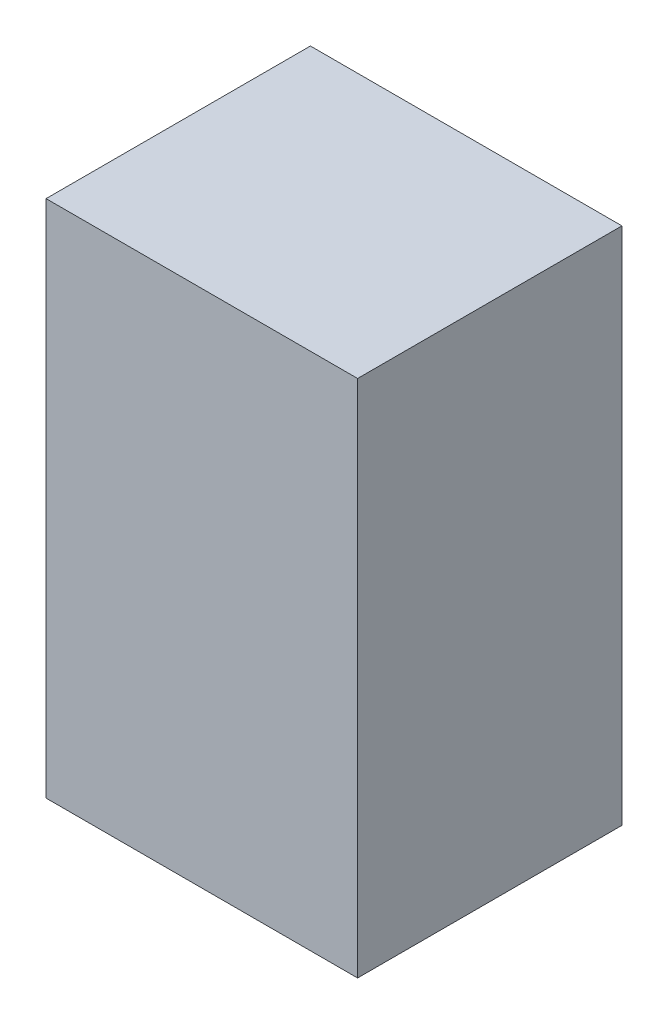
ISO-10303-21;
HEADER;
FILE_DESCRIPTION(('STEP AP214'),'2;1');
FILE_NAME('part.step','',(''),(''),'','','');
FILE_SCHEMA(('AUTOMOTIVE_DESIGN { 1 0 10303 214 1 1 1 1 }'));
ENDSEC;
DATA;
#1=APPLICATION_CONTEXT('core data for automotive mechanical design processes');
#2=APPLICATION_PROTOCOL_DEFINITION('international standard','automotive_design',2000,#1);
#3=PRODUCT_CONTEXT('',#1,'mechanical');
#4=PRODUCT('Part','Part','',(#3));
#5=PRODUCT_RELATED_PRODUCT_CATEGORY('part','',(#4));
#6=PRODUCT_DEFINITION_FORMATION('','',#4);
#7=PRODUCT_DEFINITION_CONTEXT('part definition',#1,'design');
#8=PRODUCT_DEFINITION('design','',#6,#7);
#9=PRODUCT_DEFINITION_SHAPE('','',#8);
#10=(LENGTH_UNIT() NAMED_UNIT(*) SI_UNIT(.MILLI.,.METRE.));
#11=(NAMED_UNIT(*) PLANE_ANGLE_UNIT() SI_UNIT($,.RADIAN.));
#12=(NAMED_UNIT(*) SI_UNIT($,.STERADIAN.) SOLID_ANGLE_UNIT());
#13=UNCERTAINTY_MEASURE_WITH_UNIT(LENGTH_MEASURE(1.E-05),#10,'distance_accuracy_value','');
#14=(GEOMETRIC_REPRESENTATION_CONTEXT(3) GLOBAL_UNCERTAINTY_ASSIGNED_CONTEXT((#13)) GLOBAL_UNIT_ASSIGNED_CONTEXT((#10,
#11,#12)) REPRESENTATION_CONTEXT('',''));
#15=CARTESIAN_POINT('',(0.,0.,0.));
#16=DIRECTION('',(0.,0.,1.));
#17=DIRECTION('',(1.,0.,0.));
#18=AXIS2_PLACEMENT_3D('',#15,#16,#17);
#19=CARTESIAN_POINT('',(419.1,1397.,355.6));
#20=DIRECTION('',(-1.,0.,0.));
#21=DIRECTION('',(0.,0.,1.));
#22=AXIS2_PLACEMENT_3D('',#19,#20,#21);
#23=PLANE('',#22);
#24=DIRECTION('',(0.,0.,-1.));
#25=VECTOR('',#24,1.);
#26=CARTESIAN_POINT('',(419.1,0.,355.6));
#27=LINE('',#26,#25);
#28=CARTESIAN_POINT('',(419.1,0.,355.6));
#29=VERTEX_POINT('',#28);
#30=CARTESIAN_POINT('',(419.1,0.,-355.6));
#31=VERTEX_POINT('',#30);
#32=EDGE_CURVE('E98',#29,#31,#27,.T.);
#33=ORIENTED_EDGE('',*,*,#32,.T.);
#34=DIRECTION('',(0.,-1.,0.));
#35=VECTOR('',#34,1.);
#36=CARTESIAN_POINT('',(419.1,1397.,-355.6));
#37=LINE('',#36,#35);
#38=CARTESIAN_POINT('',(419.1,1397.,-355.6));
#39=VERTEX_POINT('',#38);
#40=EDGE_CURVE('E11',#39,#31,#37,.T.);
#41=ORIENTED_EDGE('',*,*,#40,.F.);
#42=DIRECTION('',(0.,0.,-1.));
#43=VECTOR('',#42,1.);
#44=CARTESIAN_POINT('',(419.1,1397.,355.6));
#45=LINE('',#44,#43);
#46=CARTESIAN_POINT('',(419.1,1397.,355.6));
#47=VERTEX_POINT('',#46);
#48=EDGE_CURVE('E86',#47,#39,#45,.T.);
#49=ORIENTED_EDGE('',*,*,#48,.F.);
#50=DIRECTION('',(0.,-1.,0.));
#51=VECTOR('',#50,1.);
#52=CARTESIAN_POINT('',(419.1,1397.,355.6));
#53=LINE('',#52,#51);
#54=EDGE_CURVE('E94',#47,#29,#53,.T.);
#55=ORIENTED_EDGE('',*,*,#54,.T.);
#56=EDGE_LOOP('',(#33,#41,#49,#55));
#57=FACE_BOUND('',#56,.T.);
#58=ADVANCED_FACE('F35',(#57),#23,.F.);
#59=CARTESIAN_POINT('',(-419.1,1397.,-355.6));
#60=DIRECTION('',(0.,0.,1.));
#61=DIRECTION('',(1.,0.,0.));
#62=AXIS2_PLACEMENT_3D('',#59,#60,#61);
#63=PLANE('',#62);
#64=DIRECTION('',(-1.,0.,0.));
#65=VECTOR('',#64,1.);
#66=CARTESIAN_POINT('',(-419.1,0.,-355.6));
#67=LINE('',#66,#65);
#68=CARTESIAN_POINT('',(-419.1,0.,-355.6));
#69=VERTEX_POINT('',#68);
#70=EDGE_CURVE('E90',#31,#69,#67,.T.);
#71=ORIENTED_EDGE('',*,*,#70,.T.);
#72=DIRECTION('',(0.,-1.,0.));
#73=VECTOR('',#72,1.);
#74=CARTESIAN_POINT('',(-419.1,1397.,-355.6));
#75=LINE('',#74,#73);
#76=CARTESIAN_POINT('',(-419.1,1397.,-355.6));
#77=VERTEX_POINT('',#76);
#78=EDGE_CURVE('E43',#77,#69,#75,.T.);
#79=ORIENTED_EDGE('',*,*,#78,.F.);
#80=DIRECTION('',(-1.,0.,0.));
#81=VECTOR('',#80,1.);
#82=CARTESIAN_POINT('',(-419.1,1397.,-355.6));
#83=LINE('',#82,#81);
#84=EDGE_CURVE('E81',#39,#77,#83,.T.);
#85=ORIENTED_EDGE('',*,*,#84,.F.);
#86=ORIENTED_EDGE('',*,*,#40,.T.);
#87=EDGE_LOOP('',(#71,#79,#85,#86));
#88=FACE_BOUND('',#87,.T.);
#89=ADVANCED_FACE('F89',(#88),#63,.F.);
#90=CARTESIAN_POINT('',(-419.1,1397.,355.6));
#91=DIRECTION('',(1.,0.,0.));
#92=DIRECTION('',(0.,0.,-1.));
#93=AXIS2_PLACEMENT_3D('',#90,#91,#92);
#94=PLANE('',#93);
#95=DIRECTION('',(0.,0.,1.));
#96=VECTOR('',#95,1.);
#97=CARTESIAN_POINT('',(-419.1,0.,355.6));
#98=LINE('',#97,#96);
#99=CARTESIAN_POINT('',(-419.1,0.,355.6));
#100=VERTEX_POINT('',#99);
#101=EDGE_CURVE('E68',#69,#100,#98,.T.);
#102=ORIENTED_EDGE('',*,*,#101,.T.);
#103=DIRECTION('',(0.,-1.,0.));
#104=VECTOR('',#103,1.);
#105=CARTESIAN_POINT('',(-419.1,1397.,355.6));
#106=LINE('',#105,#104);
#107=CARTESIAN_POINT('',(-419.1,1397.,355.6));
#108=VERTEX_POINT('',#107);
#109=EDGE_CURVE('E91',#108,#100,#106,.T.);
#110=ORIENTED_EDGE('',*,*,#109,.F.);
#111=DIRECTION('',(0.,0.,1.));
#112=VECTOR('',#111,1.);
#113=CARTESIAN_POINT('',(-419.1,1397.,355.6));
#114=LINE('',#113,#112);
#115=EDGE_CURVE('E84',#77,#108,#114,.T.);
#116=ORIENTED_EDGE('',*,*,#115,.F.);
#117=ORIENTED_EDGE('',*,*,#78,.T.);
#118=EDGE_LOOP('',(#102,#110,#116,#117));
#119=FACE_BOUND('',#118,.T.);
#120=ADVANCED_FACE('F92',(#119),#94,.F.);
#121=CARTESIAN_POINT('',(-419.1,1397.,355.6));
#122=DIRECTION('',(0.,0.,-1.));
#123=DIRECTION('',(-1.,0.,0.));
#124=AXIS2_PLACEMENT_3D('',#121,#122,#123);
#125=PLANE('',#124);
#126=DIRECTION('',(1.,0.,0.));
#127=VECTOR('',#126,1.);
#128=CARTESIAN_POINT('',(-419.1,0.,355.6));
#129=LINE('',#128,#127);
#130=EDGE_CURVE('E74',#100,#29,#129,.T.);
#131=ORIENTED_EDGE('',*,*,#130,.T.);
#132=ORIENTED_EDGE('',*,*,#54,.F.);
#133=DIRECTION('',(1.,0.,0.));
#134=VECTOR('',#133,1.);
#135=CARTESIAN_POINT('',(-419.1,1397.,355.6));
#136=LINE('',#135,#134);
#137=EDGE_CURVE('E51',#108,#47,#136,.T.);
#138=ORIENTED_EDGE('',*,*,#137,.F.);
#139=ORIENTED_EDGE('',*,*,#109,.T.);
#140=EDGE_LOOP('',(#131,#132,#138,#139));
#141=FACE_BOUND('',#140,.T.);
#142=ADVANCED_FACE('F105',(#141),#125,.F.);
#143=CARTESIAN_POINT('',(0.,1397.,0.));
#144=DIRECTION('',(0.,-1.,0.));
#145=DIRECTION('',(0.,0.,-1.));
#146=AXIS2_PLACEMENT_3D('',#143,#144,#145);
#147=PLANE('',#146);
#148=ORIENTED_EDGE('',*,*,#48,.T.);
#149=ORIENTED_EDGE('',*,*,#84,.T.);
#150=ORIENTED_EDGE('',*,*,#115,.T.);
#151=ORIENTED_EDGE('',*,*,#137,.T.);
#152=EDGE_LOOP('',(#148,#149,#150,#151));
#153=FACE_BOUND('',#152,.T.);
#154=ADVANCED_FACE('F82',(#153),#147,.F.);
#155=CARTESIAN_POINT('',(0.,0.,0.));
#156=DIRECTION('',(0.,-1.,0.));
#157=DIRECTION('',(0.,0.,-1.));
#158=AXIS2_PLACEMENT_3D('',#155,#156,#157);
#159=PLANE('',#158);
#160=ORIENTED_EDGE('',*,*,#32,.F.);
#161=ORIENTED_EDGE('',*,*,#130,.F.);
#162=ORIENTED_EDGE('',*,*,#101,.F.);
#163=ORIENTED_EDGE('',*,*,#70,.F.);
#164=EDGE_LOOP('',(#160,#161,#162,#163));
#165=FACE_BOUND('',#164,.T.);
#166=ADVANCED_FACE('F108',(#165),#159,.T.);
#167=CLOSED_SHELL('',(#58,#89,#120,#142,#154,#166));
#168=MANIFOLD_SOLID_BREP('B2',#167);
#169=ADVANCED_BREP_SHAPE_REPRESENTATION('',(#18,#168),#14);
#170=SHAPE_DEFINITION_REPRESENTATION(#9,#169);
ENDSEC;
END-ISO-10303-21;
